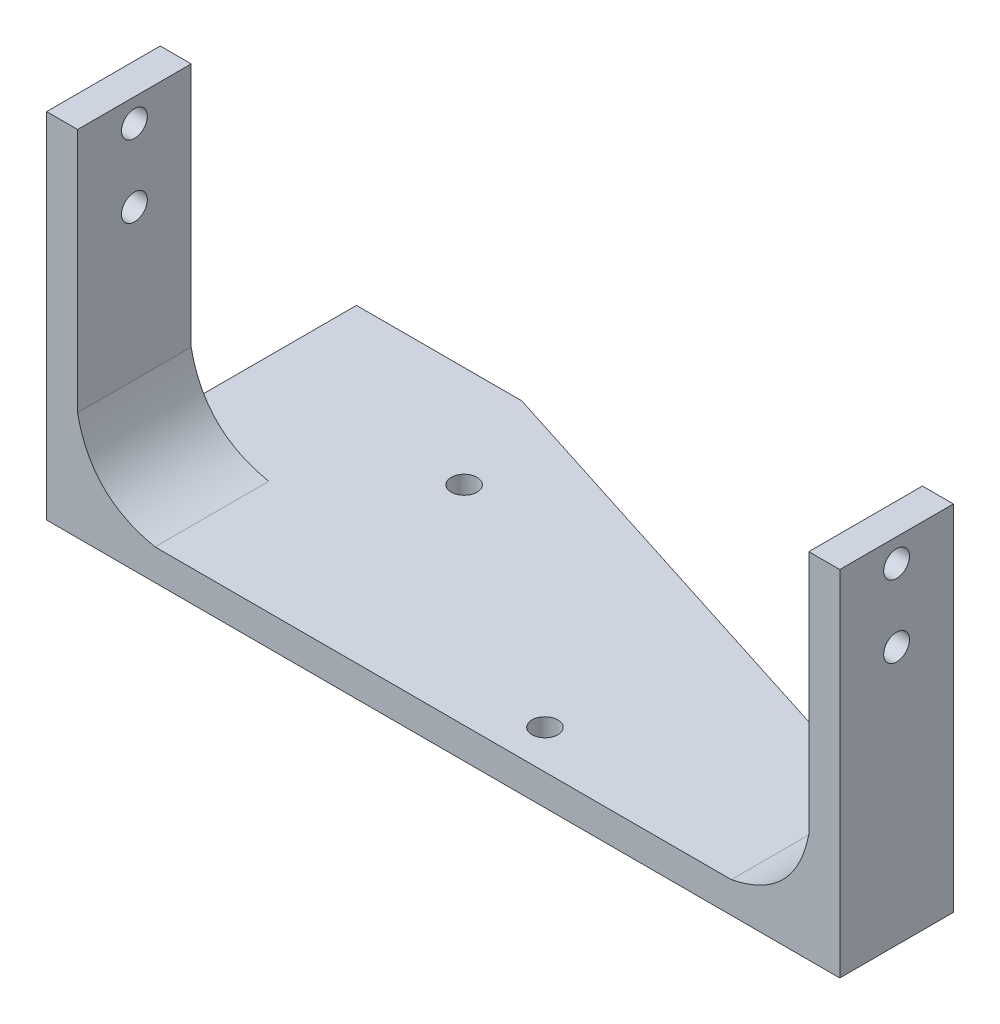
ISO-10303-21;
HEADER;
FILE_DESCRIPTION(('STEP AP214'),'2;1');
FILE_NAME('part.step','',(''),(''),'','','');
FILE_SCHEMA(('AUTOMOTIVE_DESIGN { 1 0 10303 214 1 1 1 1 }'));
ENDSEC;
DATA;
#1=APPLICATION_CONTEXT('core data for automotive mechanical design processes');
#2=APPLICATION_PROTOCOL_DEFINITION('international standard','automotive_design',2000,#1);
#3=PRODUCT_CONTEXT('',#1,'mechanical');
#4=PRODUCT('Part','Part','',(#3));
#5=PRODUCT_RELATED_PRODUCT_CATEGORY('part','',(#4));
#6=PRODUCT_DEFINITION_FORMATION('','',#4);
#7=PRODUCT_DEFINITION_CONTEXT('part definition',#1,'design');
#8=PRODUCT_DEFINITION('design','',#6,#7);
#9=PRODUCT_DEFINITION_SHAPE('','',#8);
#10=(LENGTH_UNIT() NAMED_UNIT(*) SI_UNIT(.MILLI.,.METRE.));
#11=(NAMED_UNIT(*) PLANE_ANGLE_UNIT() SI_UNIT($,.RADIAN.));
#12=(NAMED_UNIT(*) SI_UNIT($,.STERADIAN.) SOLID_ANGLE_UNIT());
#13=UNCERTAINTY_MEASURE_WITH_UNIT(LENGTH_MEASURE(1.E-05),#10,'distance_accuracy_value','');
#14=(GEOMETRIC_REPRESENTATION_CONTEXT(3) GLOBAL_UNCERTAINTY_ASSIGNED_CONTEXT((#13)) GLOBAL_UNIT_ASSIGNED_CONTEXT((#10,
#11,#12)) REPRESENTATION_CONTEXT('',''));
#15=CARTESIAN_POINT('',(0.,0.,0.));
#16=DIRECTION('',(0.,0.,1.));
#17=DIRECTION('',(1.,0.,0.));
#18=AXIS2_PLACEMENT_3D('',#15,#16,#17);
#19=CARTESIAN_POINT('',(0.,6.,0.));
#20=DIRECTION('',(0.,1.,0.));
#21=DIRECTION('',(0.,0.,1.));
#22=AXIS2_PLACEMENT_3D('',#19,#20,#21);
#23=PLANE('',#22);
#24=DIRECTION('',(0.,0.,1.));
#25=VECTOR('',#24,1.);
#26=CARTESIAN_POINT('',(132.589489933783,6.,-43.2132034355964));
#27=LINE('',#26,#25);
#28=CARTESIAN_POINT('',(132.589489933783,6.,-22.));
#29=VERTEX_POINT('',#28);
#30=CARTESIAN_POINT('',(132.589489933783,6.,0.));
#31=VERTEX_POINT('',#30);
#32=EDGE_CURVE('E379',#29,#31,#27,.T.);
#33=ORIENTED_EDGE('',*,*,#32,.F.);
#34=DIRECTION('',(1.,0.,0.));
#35=VECTOR('',#34,1.);
#36=CARTESIAN_POINT('',(0.,6.,-21.9999999999999));
#37=LINE('',#36,#35);
#38=CARTESIAN_POINT('',(151.12,6.,-22.));
#39=VERTEX_POINT('',#38);
#40=EDGE_CURVE('E56',#29,#39,#37,.T.);
#41=ORIENTED_EDGE('',*,*,#40,.T.);
#42=DIRECTION('',(-0.952698633638781,0.,-0.303916622550988));
#43=VECTOR('',#42,1.);
#44=CARTESIAN_POINT('',(32.,6.,-60.));
#45=LINE('',#44,#43);
#46=CARTESIAN_POINT('',(32.,6.,-60.));
#47=VERTEX_POINT('',#46);
#48=EDGE_CURVE('E184',#39,#47,#45,.T.);
#49=ORIENTED_EDGE('',*,*,#48,.T.);
#50=DIRECTION('',(-1.,0.,0.));
#51=VECTOR('',#50,1.);
#52=CARTESIAN_POINT('',(32.,6.,-60.));
#53=LINE('',#52,#51);
#54=CARTESIAN_POINT('',(0.,6.,-60.));
#55=VERTEX_POINT('',#54);
#56=EDGE_CURVE('E186',#47,#55,#53,.T.);
#57=ORIENTED_EDGE('',*,*,#56,.T.);
#58=DIRECTION('',(0.,0.,1.));
#59=VECTOR('',#58,1.);
#60=CARTESIAN_POINT('',(0.,6.,0.));
#61=LINE('',#60,#59);
#62=CARTESIAN_POINT('',(0.,6.,-22.));
#63=VERTEX_POINT('',#62);
#64=EDGE_CURVE('E180',#55,#63,#61,.T.);
#65=ORIENTED_EDGE('',*,*,#64,.T.);
#66=DIRECTION('',(-1.,0.,0.));
#67=VECTOR('',#66,1.);
#68=CARTESIAN_POINT('',(0.,6.,-22.));
#69=LINE('',#68,#67);
#70=CARTESIAN_POINT('',(21.,6.,-22.));
#71=VERTEX_POINT('',#70);
#72=EDGE_CURVE('E257',#71,#63,#69,.T.);
#73=ORIENTED_EDGE('',*,*,#72,.F.);
#74=DIRECTION('',(0.,0.,1.));
#75=VECTOR('',#74,1.);
#76=CARTESIAN_POINT('',(21.,6.,-43.2132034355964));
#77=LINE('',#76,#75);
#78=CARTESIAN_POINT('',(21.,6.,0.));
#79=VERTEX_POINT('',#78);
#80=EDGE_CURVE('E148',#71,#79,#77,.T.);
#81=ORIENTED_EDGE('',*,*,#80,.T.);
#82=DIRECTION('',(1.,0.,0.));
#83=VECTOR('',#82,1.);
#84=CARTESIAN_POINT('',(0.,6.,0.));
#85=LINE('',#84,#83);
#86=EDGE_CURVE('E63',#79,#31,#85,.T.);
#87=ORIENTED_EDGE('',*,*,#86,.T.);
#88=EDGE_LOOP('',(#33,#41,#49,#57,#65,#73,#81,#87));
#89=FACE_BOUND('',#88,.T.);
#90=CARTESIAN_POINT('',(40.5,6.,-40.35));
#91=DIRECTION('',(0.,1.,0.));
#92=DIRECTION('',(0.,0.,1.));
#93=AXIS2_PLACEMENT_3D('',#90,#91,#92);
#94=CIRCLE('',#93,2.5);
#95=CARTESIAN_POINT('',(40.5,6.,-37.85));
#96=VERTEX_POINT('',#95);
#97=EDGE_CURVE('E174',#96,#96,#94,.T.);
#98=ORIENTED_EDGE('',*,*,#97,.F.);
#99=EDGE_LOOP('',(#98));
#100=FACE_BOUND('',#99,.T.);
#101=CARTESIAN_POINT('',(89.,6.,-7.5));
#102=DIRECTION('',(0.,1.,0.));
#103=DIRECTION('',(0.,0.,1.));
#104=AXIS2_PLACEMENT_3D('',#101,#102,#103);
#105=CIRCLE('',#104,2.49999999999999);
#106=CARTESIAN_POINT('',(89.,6.,-5.00000000000001));
#107=VERTEX_POINT('',#106);
#108=EDGE_CURVE('E165',#107,#107,#105,.T.);
#109=ORIENTED_EDGE('',*,*,#108,.F.);
#110=EDGE_LOOP('',(#109));
#111=FACE_BOUND('',#110,.T.);
#112=ADVANCED_FACE('F39',(#89,#100,#111),#23,.T.);
#113=CARTESIAN_POINT('',(0.,0.,0.));
#114=DIRECTION('',(0.,1.,0.));
#115=DIRECTION('',(0.,0.,1.));
#116=AXIS2_PLACEMENT_3D('',#113,#114,#115);
#117=PLANE('',#116);
#118=DIRECTION('',(-0.952698633638781,0.,-0.303916622550988));
#119=VECTOR('',#118,1.);
#120=CARTESIAN_POINT('',(32.,0.,-60.));
#121=LINE('',#120,#119);
#122=CARTESIAN_POINT('',(151.12,0.,-22.));
#123=VERTEX_POINT('',#122);
#124=CARTESIAN_POINT('',(32.,0.,-60.));
#125=VERTEX_POINT('',#124);
#126=EDGE_CURVE('E193',#123,#125,#121,.T.);
#127=ORIENTED_EDGE('',*,*,#126,.F.);
#128=DIRECTION('',(1.,0.,0.));
#129=VECTOR('',#128,1.);
#130=CARTESIAN_POINT('',(147.589489933783,0.,-22.));
#131=LINE('',#130,#129);
#132=CARTESIAN_POINT('',(153.589489933783,0.,-22.));
#133=VERTEX_POINT('',#132);
#134=EDGE_CURVE('E231',#123,#133,#131,.T.);
#135=ORIENTED_EDGE('',*,*,#134,.T.);
#136=DIRECTION('',(0.,0.,1.));
#137=VECTOR('',#136,1.);
#138=CARTESIAN_POINT('',(153.589489933783,0.,-22.));
#139=LINE('',#138,#137);
#140=CARTESIAN_POINT('',(153.589489933783,0.,0.));
#141=VERTEX_POINT('',#140);
#142=EDGE_CURVE('E228',#133,#141,#139,.T.);
#143=ORIENTED_EDGE('',*,*,#142,.T.);
#144=DIRECTION('',(1.,0.,0.));
#145=VECTOR('',#144,1.);
#146=CARTESIAN_POINT('',(0.,0.,0.));
#147=LINE('',#146,#145);
#148=CARTESIAN_POINT('',(0.,0.,0.));
#149=VERTEX_POINT('',#148);
#150=EDGE_CURVE('E191',#149,#141,#147,.T.);
#151=ORIENTED_EDGE('',*,*,#150,.F.);
#152=DIRECTION('',(0.,0.,1.));
#153=VECTOR('',#152,1.);
#154=CARTESIAN_POINT('',(0.,0.,0.));
#155=LINE('',#154,#153);
#156=CARTESIAN_POINT('',(0.,0.,-60.));
#157=VERTEX_POINT('',#156);
#158=EDGE_CURVE('E177',#157,#149,#155,.T.);
#159=ORIENTED_EDGE('',*,*,#158,.F.);
#160=DIRECTION('',(-1.,0.,0.));
#161=VECTOR('',#160,1.);
#162=CARTESIAN_POINT('',(32.,0.,-60.));
#163=LINE('',#162,#161);
#164=EDGE_CURVE('E182',#125,#157,#163,.T.);
#165=ORIENTED_EDGE('',*,*,#164,.F.);
#166=EDGE_LOOP('',(#127,#135,#143,#151,#159,#165));
#167=FACE_BOUND('',#166,.T.);
#168=CARTESIAN_POINT('',(89.,0.,-7.5));
#169=DIRECTION('',(0.,1.,0.));
#170=DIRECTION('',(0.,0.,1.));
#171=AXIS2_PLACEMENT_3D('',#168,#169,#170);
#172=CIRCLE('',#171,2.49999999999999);
#173=CARTESIAN_POINT('',(89.,0.,-5.00000000000001));
#174=VERTEX_POINT('',#173);
#175=EDGE_CURVE('E161',#174,#174,#172,.T.);
#176=ORIENTED_EDGE('',*,*,#175,.T.);
#177=EDGE_LOOP('',(#176));
#178=FACE_BOUND('',#177,.T.);
#179=CARTESIAN_POINT('',(40.5,0.,-40.35));
#180=DIRECTION('',(0.,1.,0.));
#181=DIRECTION('',(0.,0.,1.));
#182=AXIS2_PLACEMENT_3D('',#179,#180,#181);
#183=CIRCLE('',#182,2.5);
#184=CARTESIAN_POINT('',(40.5,0.,-37.85));
#185=VERTEX_POINT('',#184);
#186=EDGE_CURVE('E172',#185,#185,#183,.T.);
#187=ORIENTED_EDGE('',*,*,#186,.T.);
#188=EDGE_LOOP('',(#187));
#189=FACE_BOUND('',#188,.T.);
#190=ADVANCED_FACE('F286',(#167,#178,#189),#117,.F.);
#191=CARTESIAN_POINT('',(0.,6.,0.));
#192=DIRECTION('',(1.,0.,0.));
#193=DIRECTION('',(0.,0.,-1.));
#194=AXIS2_PLACEMENT_3D('',#191,#192,#193);
#195=PLANE('',#194);
#196=CARTESIAN_POINT('',(0.,64.,-11.));
#197=DIRECTION('',(-1.,0.,0.));
#198=DIRECTION('',(0.,0.,1.));
#199=AXIS2_PLACEMENT_3D('',#196,#197,#198);
#200=CIRCLE('',#199,2.5);
#201=CARTESIAN_POINT('',(0.,64.,-8.5));
#202=VERTEX_POINT('',#201);
#203=EDGE_CURVE('E211',#202,#202,#200,.T.);
#204=ORIENTED_EDGE('',*,*,#203,.F.);
#205=EDGE_LOOP('',(#204));
#206=FACE_BOUND('',#205,.T.);
#207=CARTESIAN_POINT('',(0.,50.,-11.));
#208=DIRECTION('',(-1.,0.,0.));
#209=DIRECTION('',(0.,0.,1.));
#210=AXIS2_PLACEMENT_3D('',#207,#208,#209);
#211=CIRCLE('',#210,2.5);
#212=CARTESIAN_POINT('',(0.,50.,-8.5));
#213=VERTEX_POINT('',#212);
#214=EDGE_CURVE('E216',#213,#213,#211,.T.);
#215=ORIENTED_EDGE('',*,*,#214,.F.);
#216=EDGE_LOOP('',(#215));
#217=FACE_BOUND('',#216,.T.);
#218=ORIENTED_EDGE('',*,*,#158,.T.);
#219=DIRECTION('',(0.,-1.,0.));
#220=VECTOR('',#219,1.);
#221=CARTESIAN_POINT('',(0.,6.,0.));
#222=LINE('',#221,#220);
#223=CARTESIAN_POINT('',(0.,68.5,0.));
#224=VERTEX_POINT('',#223);
#225=EDGE_CURVE('E11',#224,#149,#222,.T.);
#226=ORIENTED_EDGE('',*,*,#225,.F.);
#227=DIRECTION('',(0.,0.,1.));
#228=VECTOR('',#227,1.);
#229=CARTESIAN_POINT('',(0.,68.5,0.));
#230=LINE('',#229,#228);
#231=CARTESIAN_POINT('',(0.,68.5,-22.));
#232=VERTEX_POINT('',#231);
#233=EDGE_CURVE('E258',#232,#224,#230,.T.);
#234=ORIENTED_EDGE('',*,*,#233,.F.);
#235=DIRECTION('',(0.,-1.,0.));
#236=VECTOR('',#235,1.);
#237=CARTESIAN_POINT('',(0.,68.5,-22.));
#238=LINE('',#237,#236);
#239=EDGE_CURVE('E167',#232,#63,#238,.T.);
#240=ORIENTED_EDGE('',*,*,#239,.T.);
#241=ORIENTED_EDGE('',*,*,#64,.F.);
#242=DIRECTION('',(0.,-1.,0.));
#243=VECTOR('',#242,1.);
#244=CARTESIAN_POINT('',(0.,6.,-60.));
#245=LINE('',#244,#243);
#246=EDGE_CURVE('E188',#55,#157,#245,.T.);
#247=ORIENTED_EDGE('',*,*,#246,.T.);
#248=EDGE_LOOP('',(#218,#226,#234,#240,#241,#247));
#249=FACE_BOUND('',#248,.T.);
#250=ADVANCED_FACE('F41',(#206,#217,#249),#195,.F.);
#251=CARTESIAN_POINT('',(0.,6.,0.));
#252=DIRECTION('',(0.,0.,-1.));
#253=DIRECTION('',(-1.,0.,0.));
#254=AXIS2_PLACEMENT_3D('',#251,#252,#253);
#255=PLANE('',#254);
#256=ORIENTED_EDGE('',*,*,#86,.F.);
#257=CARTESIAN_POINT('',(21.,6.,0.));
#258=CARTESIAN_POINT('',(8.5,8.5,0.));
#259=CARTESIAN_POINT('',(6.,21.,0.));
#260=B_SPLINE_CURVE_WITH_KNOTS('',2,(#257,#258,#259),.UNSPECIFIED.,.F.,.F.,(3,3),(0.,1.),.UNSPECIFIED.);
#261=CARTESIAN_POINT('',(6.,21.,0.));
#262=VERTEX_POINT('',#261);
#263=EDGE_CURVE('E141',#79,#262,#260,.T.);
#264=ORIENTED_EDGE('',*,*,#263,.T.);
#265=DIRECTION('',(0.,-1.,0.));
#266=VECTOR('',#265,1.);
#267=CARTESIAN_POINT('',(6.,68.5,0.));
#268=LINE('',#267,#266);
#269=CARTESIAN_POINT('',(6.,68.5,0.));
#270=VERTEX_POINT('',#269);
#271=EDGE_CURVE('E154',#270,#262,#268,.T.);
#272=ORIENTED_EDGE('',*,*,#271,.F.);
#273=DIRECTION('',(1.,0.,0.));
#274=VECTOR('',#273,1.);
#275=CARTESIAN_POINT('',(0.,68.5,0.));
#276=LINE('',#275,#274);
#277=EDGE_CURVE('E261',#224,#270,#276,.T.);
#278=ORIENTED_EDGE('',*,*,#277,.F.);
#279=ORIENTED_EDGE('',*,*,#225,.T.);
#280=ORIENTED_EDGE('',*,*,#150,.T.);
#281=DIRECTION('',(0.,-1.,0.));
#282=VECTOR('',#281,1.);
#283=CARTESIAN_POINT('',(153.589489933783,91.3035085019828,0.));
#284=LINE('',#283,#282);
#285=CARTESIAN_POINT('',(153.589489933783,68.5,0.));
#286=VERTEX_POINT('',#285);
#287=EDGE_CURVE('E248',#286,#141,#284,.T.);
#288=ORIENTED_EDGE('',*,*,#287,.F.);
#289=DIRECTION('',(-1.,0.,0.));
#290=VECTOR('',#289,1.);
#291=CARTESIAN_POINT('',(147.589489933783,68.5,0.));
#292=LINE('',#291,#290);
#293=CARTESIAN_POINT('',(147.589489933783,68.5,0.));
#294=VERTEX_POINT('',#293);
#295=EDGE_CURVE('E237',#286,#294,#292,.T.);
#296=ORIENTED_EDGE('',*,*,#295,.T.);
#297=DIRECTION('',(0.,-1.,0.));
#298=VECTOR('',#297,1.);
#299=CARTESIAN_POINT('',(147.589489933783,91.3035085019828,0.));
#300=LINE('',#299,#298);
#301=CARTESIAN_POINT('',(147.589489933783,21.,0.));
#302=VERTEX_POINT('',#301);
#303=EDGE_CURVE('E251',#294,#302,#300,.T.);
#304=ORIENTED_EDGE('',*,*,#303,.T.);
#305=CARTESIAN_POINT('',(147.589489933783,21.,0.));
#306=CARTESIAN_POINT('',(145.089489933783,8.5,0.));
#307=CARTESIAN_POINT('',(132.589489933783,6.,0.));
#308=B_SPLINE_CURVE_WITH_KNOTS('',2,(#305,#306,#307),.UNSPECIFIED.,.F.,.F.,(3,3),(0.,1.),.UNSPECIFIED.);
#309=EDGE_CURVE('E157',#302,#31,#308,.T.);
#310=ORIENTED_EDGE('',*,*,#309,.T.);
#311=EDGE_LOOP('',(#256,#264,#272,#278,#279,#280,#288,#296,#304,#310));
#312=FACE_BOUND('',#311,.T.);
#313=ADVANCED_FACE('F152',(#312),#255,.F.);
#314=CARTESIAN_POINT('',(32.,6.,-60.));
#315=DIRECTION('',(-0.303916622550988,0.,0.952698633638781));
#316=DIRECTION('',(0.952698633638781,0.,0.303916622550988));
#317=AXIS2_PLACEMENT_3D('',#314,#315,#316);
#318=PLANE('',#317);
#319=ORIENTED_EDGE('',*,*,#126,.T.);
#320=DIRECTION('',(0.,-1.,0.));
#321=VECTOR('',#320,1.);
#322=CARTESIAN_POINT('',(32.,6.,-60.));
#323=LINE('',#322,#321);
#324=EDGE_CURVE('E198',#47,#125,#323,.T.);
#325=ORIENTED_EDGE('',*,*,#324,.F.);
#326=ORIENTED_EDGE('',*,*,#48,.F.);
#327=DIRECTION('',(0.,-1.,0.));
#328=VECTOR('',#327,1.);
#329=CARTESIAN_POINT('',(151.12,6.,-22.));
#330=LINE('',#329,#328);
#331=EDGE_CURVE('E48',#39,#123,#330,.T.);
#332=ORIENTED_EDGE('',*,*,#331,.T.);
#333=EDGE_LOOP('',(#319,#325,#326,#332));
#334=FACE_BOUND('',#333,.T.);
#335=ADVANCED_FACE('F315',(#334),#318,.F.);
#336=CARTESIAN_POINT('',(32.,6.,-60.));
#337=DIRECTION('',(0.,0.,1.));
#338=DIRECTION('',(1.,0.,0.));
#339=AXIS2_PLACEMENT_3D('',#336,#337,#338);
#340=PLANE('',#339);
#341=ORIENTED_EDGE('',*,*,#164,.T.);
#342=ORIENTED_EDGE('',*,*,#246,.F.);
#343=ORIENTED_EDGE('',*,*,#56,.F.);
#344=ORIENTED_EDGE('',*,*,#324,.T.);
#345=EDGE_LOOP('',(#341,#342,#343,#344));
#346=FACE_BOUND('',#345,.T.);
#347=ADVANCED_FACE('F281',(#346),#340,.F.);
#348=CARTESIAN_POINT('',(40.5,6.,-40.35));
#349=DIRECTION('',(0.,-1.,0.));
#350=DIRECTION('',(0.,0.,-1.));
#351=AXIS2_PLACEMENT_3D('',#348,#349,#350);
#352=CYLINDRICAL_SURFACE('',#351,2.5);
#353=ORIENTED_EDGE('',*,*,#97,.T.);
#354=EDGE_LOOP('',(#353));
#355=FACE_BOUND('',#354,.T.);
#356=ORIENTED_EDGE('',*,*,#186,.F.);
#357=EDGE_LOOP('',(#356));
#358=FACE_BOUND('',#357,.T.);
#359=ADVANCED_FACE('F310',(#355,#358),#352,.F.);
#360=CARTESIAN_POINT('',(89.,6.,-7.5));
#361=DIRECTION('',(0.,-1.,0.));
#362=DIRECTION('',(0.,0.,-1.));
#363=AXIS2_PLACEMENT_3D('',#360,#361,#362);
#364=CYLINDRICAL_SURFACE('',#363,2.49999999999999);
#365=ORIENTED_EDGE('',*,*,#108,.T.);
#366=EDGE_LOOP('',(#365));
#367=FACE_BOUND('',#366,.T.);
#368=ORIENTED_EDGE('',*,*,#175,.F.);
#369=EDGE_LOOP('',(#368));
#370=FACE_BOUND('',#369,.T.);
#371=ADVANCED_FACE('F339',(#367,#370),#364,.F.);
#372=CARTESIAN_POINT('',(6.,68.5,0.));
#373=DIRECTION('',(-1.,0.,0.));
#374=DIRECTION('',(0.,0.,1.));
#375=AXIS2_PLACEMENT_3D('',#372,#373,#374);
#376=PLANE('',#375);
#377=CARTESIAN_POINT('',(6.00000000000001,64.,-11.));
#378=DIRECTION('',(-1.,0.,0.));
#379=DIRECTION('',(0.,0.,1.));
#380=AXIS2_PLACEMENT_3D('',#377,#378,#379);
#381=CIRCLE('',#380,2.5);
#382=CARTESIAN_POINT('',(6.00000000000001,64.,-8.5));
#383=VERTEX_POINT('',#382);
#384=EDGE_CURVE('E225',#383,#383,#381,.T.);
#385=ORIENTED_EDGE('',*,*,#384,.T.);
#386=EDGE_LOOP('',(#385));
#387=FACE_BOUND('',#386,.T.);
#388=CARTESIAN_POINT('',(6.00000000000001,50.,-11.));
#389=DIRECTION('',(-1.,0.,0.));
#390=DIRECTION('',(0.,0.,1.));
#391=AXIS2_PLACEMENT_3D('',#388,#389,#390);
#392=CIRCLE('',#391,2.5);
#393=CARTESIAN_POINT('',(6.00000000000001,50.,-8.5));
#394=VERTEX_POINT('',#393);
#395=EDGE_CURVE('E204',#394,#394,#392,.T.);
#396=ORIENTED_EDGE('',*,*,#395,.T.);
#397=EDGE_LOOP('',(#396));
#398=FACE_BOUND('',#397,.T.);
#399=ORIENTED_EDGE('',*,*,#271,.T.);
#400=DIRECTION('',(0.,0.,1.));
#401=VECTOR('',#400,1.);
#402=CARTESIAN_POINT('',(6.,21.,-43.2132034355964));
#403=LINE('',#402,#401);
#404=CARTESIAN_POINT('',(6.,21.,-22.));
#405=VERTEX_POINT('',#404);
#406=EDGE_CURVE('E137',#405,#262,#403,.T.);
#407=ORIENTED_EDGE('',*,*,#406,.F.);
#408=DIRECTION('',(0.,-1.,0.));
#409=VECTOR('',#408,1.);
#410=CARTESIAN_POINT('',(6.,68.5,-22.));
#411=LINE('',#410,#409);
#412=CARTESIAN_POINT('',(6.,68.5,-22.));
#413=VERTEX_POINT('',#412);
#414=EDGE_CURVE('E162',#413,#405,#411,.T.);
#415=ORIENTED_EDGE('',*,*,#414,.F.);
#416=DIRECTION('',(0.,0.,-1.));
#417=VECTOR('',#416,1.);
#418=CARTESIAN_POINT('',(6.,68.5,0.));
#419=LINE('',#418,#417);
#420=EDGE_CURVE('E160',#270,#413,#419,.T.);
#421=ORIENTED_EDGE('',*,*,#420,.F.);
#422=EDGE_LOOP('',(#399,#407,#415,#421));
#423=FACE_BOUND('',#422,.T.);
#424=ADVANCED_FACE('F159',(#387,#398,#423),#376,.F.);
#425=CARTESIAN_POINT('',(0.,68.5,-22.));
#426=DIRECTION('',(0.,0.,1.));
#427=DIRECTION('',(1.,0.,0.));
#428=AXIS2_PLACEMENT_3D('',#425,#426,#427);
#429=PLANE('',#428);
#430=ORIENTED_EDGE('',*,*,#72,.T.);
#431=ORIENTED_EDGE('',*,*,#239,.F.);
#432=DIRECTION('',(-1.,0.,0.));
#433=VECTOR('',#432,1.);
#434=CARTESIAN_POINT('',(0.,68.5,-22.));
#435=LINE('',#434,#433);
#436=EDGE_CURVE('E264',#413,#232,#435,.T.);
#437=ORIENTED_EDGE('',*,*,#436,.F.);
#438=ORIENTED_EDGE('',*,*,#414,.T.);
#439=CARTESIAN_POINT('',(21.,6.,-22.));
#440=CARTESIAN_POINT('',(8.5,8.5,-22.));
#441=CARTESIAN_POINT('',(6.,21.,-22.));
#442=B_SPLINE_CURVE_WITH_KNOTS('',2,(#439,#440,#441),.UNSPECIFIED.,.F.,.F.,(3,3),(0.,1.),.UNSPECIFIED.);
#443=EDGE_CURVE('E143',#405,#71,#442,.F.);
#444=ORIENTED_EDGE('',*,*,#443,.T.);
#445=EDGE_LOOP('',(#430,#431,#437,#438,#444));
#446=FACE_BOUND('',#445,.T.);
#447=ADVANCED_FACE('F274',(#446),#429,.F.);
#448=CARTESIAN_POINT('',(0.,68.5,0.));
#449=DIRECTION('',(0.,-1.,0.));
#450=DIRECTION('',(0.,0.,-1.));
#451=AXIS2_PLACEMENT_3D('',#448,#449,#450);
#452=PLANE('',#451);
#453=ORIENTED_EDGE('',*,*,#233,.T.);
#454=ORIENTED_EDGE('',*,*,#277,.T.);
#455=ORIENTED_EDGE('',*,*,#420,.T.);
#456=ORIENTED_EDGE('',*,*,#436,.T.);
#457=EDGE_LOOP('',(#453,#454,#455,#456));
#458=FACE_BOUND('',#457,.T.);
#459=ADVANCED_FACE('F291',(#458),#452,.F.);
#460=CARTESIAN_POINT('',(147.589489933783,91.3035085019828,-22.));
#461=DIRECTION('',(0.,0.,1.));
#462=DIRECTION('',(1.,0.,0.));
#463=AXIS2_PLACEMENT_3D('',#460,#461,#462);
#464=PLANE('',#463);
#465=ORIENTED_EDGE('',*,*,#40,.F.);
#466=CARTESIAN_POINT('',(147.589489933783,21.,-22.));
#467=CARTESIAN_POINT('',(145.089489933783,8.5,-22.));
#468=CARTESIAN_POINT('',(132.589489933783,6.,-22.));
#469=B_SPLINE_CURVE_WITH_KNOTS('',2,(#466,#467,#468),.UNSPECIFIED.,.F.,.F.,(3,3),(0.,1.),.UNSPECIFIED.);
#470=CARTESIAN_POINT('',(147.589489933783,21.,-22.));
#471=VERTEX_POINT('',#470);
#472=EDGE_CURVE('E375',#29,#471,#469,.F.);
#473=ORIENTED_EDGE('',*,*,#472,.T.);
#474=DIRECTION('',(0.,-1.,0.));
#475=VECTOR('',#474,1.);
#476=CARTESIAN_POINT('',(147.589489933783,91.3035085019828,-22.));
#477=LINE('',#476,#475);
#478=CARTESIAN_POINT('',(147.589489933783,68.5,-22.));
#479=VERTEX_POINT('',#478);
#480=EDGE_CURVE('E233',#479,#471,#477,.T.);
#481=ORIENTED_EDGE('',*,*,#480,.F.);
#482=DIRECTION('',(1.,0.,0.));
#483=VECTOR('',#482,1.);
#484=CARTESIAN_POINT('',(147.589489933783,68.5,-22.));
#485=LINE('',#484,#483);
#486=CARTESIAN_POINT('',(153.589489933783,68.5,-22.));
#487=VERTEX_POINT('',#486);
#488=EDGE_CURVE('E238',#479,#487,#485,.T.);
#489=ORIENTED_EDGE('',*,*,#488,.T.);
#490=DIRECTION('',(0.,-1.,0.));
#491=VECTOR('',#490,1.);
#492=CARTESIAN_POINT('',(153.589489933783,91.3035085019828,-22.));
#493=LINE('',#492,#491);
#494=EDGE_CURVE('E245',#487,#133,#493,.T.);
#495=ORIENTED_EDGE('',*,*,#494,.T.);
#496=ORIENTED_EDGE('',*,*,#134,.F.);
#497=ORIENTED_EDGE('',*,*,#331,.F.);
#498=EDGE_LOOP('',(#465,#473,#481,#489,#495,#496,#497));
#499=FACE_BOUND('',#498,.T.);
#500=ADVANCED_FACE('F293',(#499),#464,.F.);
#501=CARTESIAN_POINT('',(153.589489933783,91.3035085019828,-22.));
#502=DIRECTION('',(-1.,0.,0.));
#503=DIRECTION('',(0.,0.,1.));
#504=AXIS2_PLACEMENT_3D('',#501,#502,#503);
#505=PLANE('',#504);
#506=CARTESIAN_POINT('',(153.589489933783,64.,-11.));
#507=DIRECTION('',(-1.,0.,0.));
#508=DIRECTION('',(0.,0.,1.));
#509=AXIS2_PLACEMENT_3D('',#506,#507,#508);
#510=CIRCLE('',#509,2.5);
#511=CARTESIAN_POINT('',(153.589489933783,64.,-8.5));
#512=VERTEX_POINT('',#511);
#513=EDGE_CURVE('E205',#512,#512,#510,.T.);
#514=ORIENTED_EDGE('',*,*,#513,.T.);
#515=EDGE_LOOP('',(#514));
#516=FACE_BOUND('',#515,.T.);
#517=CARTESIAN_POINT('',(153.589489933783,50.,-11.));
#518=DIRECTION('',(-1.,0.,0.));
#519=DIRECTION('',(0.,0.,1.));
#520=AXIS2_PLACEMENT_3D('',#517,#518,#519);
#521=CIRCLE('',#520,2.5);
#522=CARTESIAN_POINT('',(153.589489933783,50.,-8.5));
#523=VERTEX_POINT('',#522);
#524=EDGE_CURVE('E222',#523,#523,#521,.T.);
#525=ORIENTED_EDGE('',*,*,#524,.T.);
#526=EDGE_LOOP('',(#525));
#527=FACE_BOUND('',#526,.T.);
#528=ORIENTED_EDGE('',*,*,#494,.F.);
#529=DIRECTION('',(0.,0.,1.));
#530=VECTOR('',#529,1.);
#531=CARTESIAN_POINT('',(153.589489933783,68.5,-22.));
#532=LINE('',#531,#530);
#533=EDGE_CURVE('E234',#487,#286,#532,.T.);
#534=ORIENTED_EDGE('',*,*,#533,.T.);
#535=ORIENTED_EDGE('',*,*,#287,.T.);
#536=ORIENTED_EDGE('',*,*,#142,.F.);
#537=EDGE_LOOP('',(#528,#534,#535,#536));
#538=FACE_BOUND('',#537,.T.);
#539=ADVANCED_FACE('F299',(#516,#527,#538),#505,.F.);
#540=CARTESIAN_POINT('',(147.589489933783,91.3035085019828,-22.));
#541=DIRECTION('',(1.,0.,0.));
#542=DIRECTION('',(0.,0.,-1.));
#543=AXIS2_PLACEMENT_3D('',#540,#541,#542);
#544=PLANE('',#543);
#545=CARTESIAN_POINT('',(147.589489933783,64.,-11.));
#546=DIRECTION('',(1.,0.,0.));
#547=DIRECTION('',(0.,0.,-1.));
#548=AXIS2_PLACEMENT_3D('',#545,#546,#547);
#549=CIRCLE('',#548,2.5);
#550=CARTESIAN_POINT('',(147.589489933783,64.,-13.5));
#551=VERTEX_POINT('',#550);
#552=EDGE_CURVE('E43',#551,#551,#549,.T.);
#553=ORIENTED_EDGE('',*,*,#552,.T.);
#554=EDGE_LOOP('',(#553));
#555=FACE_BOUND('',#554,.T.);
#556=CARTESIAN_POINT('',(147.589489933783,50.,-11.));
#557=DIRECTION('',(1.,0.,0.));
#558=DIRECTION('',(0.,0.,-1.));
#559=AXIS2_PLACEMENT_3D('',#556,#557,#558);
#560=CIRCLE('',#559,2.5);
#561=CARTESIAN_POINT('',(147.589489933783,50.,-13.5));
#562=VERTEX_POINT('',#561);
#563=EDGE_CURVE('E202',#562,#562,#560,.T.);
#564=ORIENTED_EDGE('',*,*,#563,.T.);
#565=EDGE_LOOP('',(#564));
#566=FACE_BOUND('',#565,.T.);
#567=ORIENTED_EDGE('',*,*,#480,.T.);
#568=DIRECTION('',(0.,0.,1.));
#569=VECTOR('',#568,1.);
#570=CARTESIAN_POINT('',(147.589489933783,21.,-43.2132034355964));
#571=LINE('',#570,#569);
#572=EDGE_CURVE('E373',#471,#302,#571,.T.);
#573=ORIENTED_EDGE('',*,*,#572,.T.);
#574=ORIENTED_EDGE('',*,*,#303,.F.);
#575=DIRECTION('',(0.,0.,-1.));
#576=VECTOR('',#575,1.);
#577=CARTESIAN_POINT('',(147.589489933783,68.5,-22.));
#578=LINE('',#577,#576);
#579=EDGE_CURVE('E241',#294,#479,#578,.T.);
#580=ORIENTED_EDGE('',*,*,#579,.T.);
#581=EDGE_LOOP('',(#567,#573,#574,#580));
#582=FACE_BOUND('',#581,.T.);
#583=ADVANCED_FACE('F367',(#555,#566,#582),#544,.F.);
#584=CARTESIAN_POINT('',(0.,68.5,0.));
#585=DIRECTION('',(0.,-1.,0.));
#586=DIRECTION('',(0.,0.,-1.));
#587=AXIS2_PLACEMENT_3D('',#584,#585,#586);
#588=PLANE('',#587);
#589=ORIENTED_EDGE('',*,*,#295,.F.);
#590=ORIENTED_EDGE('',*,*,#533,.F.);
#591=ORIENTED_EDGE('',*,*,#488,.F.);
#592=ORIENTED_EDGE('',*,*,#579,.F.);
#593=EDGE_LOOP('',(#589,#590,#591,#592));
#594=FACE_BOUND('',#593,.T.);
#595=ADVANCED_FACE('F361',(#594),#588,.F.);
#596=CARTESIAN_POINT('',(153.589489933783,50.,-11.));
#597=DIRECTION('',(-1.,0.,0.));
#598=DIRECTION('',(0.,0.,1.));
#599=AXIS2_PLACEMENT_3D('',#596,#597,#598);
#600=CYLINDRICAL_SURFACE('',#599,2.5);
#601=ORIENTED_EDGE('',*,*,#524,.F.);
#602=EDGE_LOOP('',(#601));
#603=FACE_BOUND('',#602,.T.);
#604=ORIENTED_EDGE('',*,*,#563,.F.);
#605=EDGE_LOOP('',(#604));
#606=FACE_BOUND('',#605,.T.);
#607=ADVANCED_FACE('F335',(#603,#606),#600,.F.);
#608=CARTESIAN_POINT('',(153.589489933783,64.,-11.));
#609=DIRECTION('',(-1.,0.,0.));
#610=DIRECTION('',(0.,0.,1.));
#611=AXIS2_PLACEMENT_3D('',#608,#609,#610);
#612=CYLINDRICAL_SURFACE('',#611,2.5);
#613=ORIENTED_EDGE('',*,*,#513,.F.);
#614=EDGE_LOOP('',(#613));
#615=FACE_BOUND('',#614,.T.);
#616=ORIENTED_EDGE('',*,*,#552,.F.);
#617=EDGE_LOOP('',(#616));
#618=FACE_BOUND('',#617,.T.);
#619=ADVANCED_FACE('F333',(#615,#618),#612,.F.);
#620=ORIENTED_EDGE('',*,*,#214,.T.);
#621=EDGE_LOOP('',(#620));
#622=FACE_BOUND('',#621,.T.);
#623=ORIENTED_EDGE('',*,*,#395,.F.);
#624=EDGE_LOOP('',(#623));
#625=FACE_BOUND('',#624,.T.);
#626=ADVANCED_FACE('F329',(#622,#625),#600,.F.);
#627=ORIENTED_EDGE('',*,*,#203,.T.);
#628=EDGE_LOOP('',(#627));
#629=FACE_BOUND('',#628,.T.);
#630=ORIENTED_EDGE('',*,*,#384,.F.);
#631=EDGE_LOOP('',(#630));
#632=FACE_BOUND('',#631,.T.);
#633=ADVANCED_FACE('F332',(#629,#632),#612,.F.);
#634=CARTESIAN_POINT('',(21.,6.,-43.2132034355964));
#635=CARTESIAN_POINT('',(8.5,8.5,-43.2132034355964));
#636=CARTESIAN_POINT('',(6.,21.,-43.2132034355964));
#637=B_SPLINE_CURVE_WITH_KNOTS('',2,(#634,#635,#636),.UNSPECIFIED.,.F.,.F.,(3,3),(0.,1.),.UNSPECIFIED.);
#638=DIRECTION('',(0.,0.,1.));
#639=VECTOR('',#638,1.);
#640=SURFACE_OF_LINEAR_EXTRUSION('',#637,#639);
#641=ORIENTED_EDGE('',*,*,#443,.F.);
#642=ORIENTED_EDGE('',*,*,#406,.T.);
#643=ORIENTED_EDGE('',*,*,#263,.F.);
#644=ORIENTED_EDGE('',*,*,#80,.F.);
#645=EDGE_LOOP('',(#641,#642,#643,#644));
#646=FACE_BOUND('',#645,.T.);
#647=ADVANCED_FACE('F139',(#646),#640,.T.);
#648=CARTESIAN_POINT('',(147.589489933783,21.,-43.2132034355964));
#649=CARTESIAN_POINT('',(145.089489933783,8.5,-43.2132034355964));
#650=CARTESIAN_POINT('',(132.589489933783,6.,-43.2132034355964));
#651=B_SPLINE_CURVE_WITH_KNOTS('',2,(#648,#649,#650),.UNSPECIFIED.,.F.,.F.,(3,3),(0.,1.),.UNSPECIFIED.);
#652=DIRECTION('',(0.,0.,1.));
#653=VECTOR('',#652,1.);
#654=SURFACE_OF_LINEAR_EXTRUSION('',#651,#653);
#655=ORIENTED_EDGE('',*,*,#472,.F.);
#656=ORIENTED_EDGE('',*,*,#32,.T.);
#657=ORIENTED_EDGE('',*,*,#309,.F.);
#658=ORIENTED_EDGE('',*,*,#572,.F.);
#659=EDGE_LOOP('',(#655,#656,#657,#658));
#660=FACE_BOUND('',#659,.T.);
#661=ADVANCED_FACE('F354',(#660),#654,.T.);
#662=CLOSED_SHELL('',(#112,#190,#250,#313,#335,#347,#359,#371,#424,#447,#459,#500,#539,#583,
#595,#607,#619,#626,#633,#647,#661));
#663=MANIFOLD_SOLID_BREP('B2',#662);
#664=ADVANCED_BREP_SHAPE_REPRESENTATION('',(#18,#663),#14);
#665=SHAPE_DEFINITION_REPRESENTATION(#9,#664);
ENDSEC;
END-ISO-10303-21;
